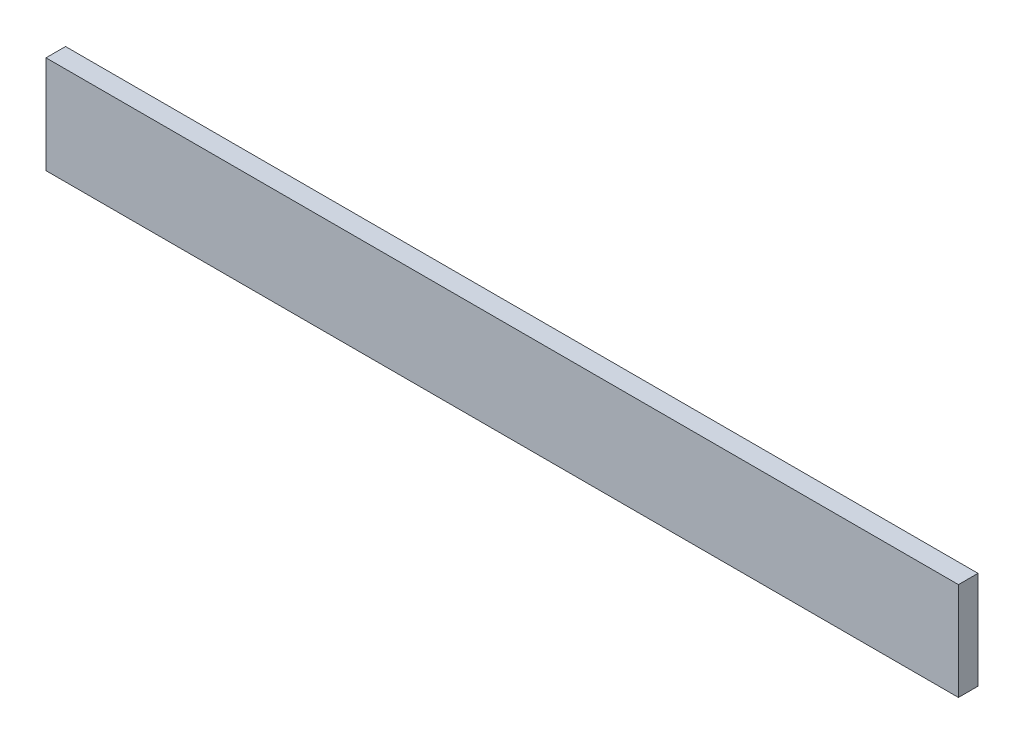
ISO-10303-21;
HEADER;
FILE_DESCRIPTION(('STEP AP214'),'2;1');
FILE_NAME('part.step','',(''),(''),'','','');
FILE_SCHEMA(('AUTOMOTIVE_DESIGN { 1 0 10303 214 1 1 1 1 }'));
ENDSEC;
DATA;
#1=APPLICATION_CONTEXT('core data for automotive mechanical design processes');
#2=APPLICATION_PROTOCOL_DEFINITION('international standard','automotive_design',2000,#1);
#3=PRODUCT_CONTEXT('',#1,'mechanical');
#4=PRODUCT('Part','Part','',(#3));
#5=PRODUCT_RELATED_PRODUCT_CATEGORY('part','',(#4));
#6=PRODUCT_DEFINITION_FORMATION('','',#4);
#7=PRODUCT_DEFINITION_CONTEXT('part definition',#1,'design');
#8=PRODUCT_DEFINITION('design','',#6,#7);
#9=PRODUCT_DEFINITION_SHAPE('','',#8);
#10=(LENGTH_UNIT() NAMED_UNIT(*) SI_UNIT(.MILLI.,.METRE.));
#11=(NAMED_UNIT(*) PLANE_ANGLE_UNIT() SI_UNIT($,.RADIAN.));
#12=(NAMED_UNIT(*) SI_UNIT($,.STERADIAN.) SOLID_ANGLE_UNIT());
#13=UNCERTAINTY_MEASURE_WITH_UNIT(LENGTH_MEASURE(1.E-05),#10,'distance_accuracy_value','');
#14=(GEOMETRIC_REPRESENTATION_CONTEXT(3) GLOBAL_UNCERTAINTY_ASSIGNED_CONTEXT((#13)) GLOBAL_UNIT_ASSIGNED_CONTEXT((#10,
#11,#12)) REPRESENTATION_CONTEXT('',''));
#15=CARTESIAN_POINT('',(0.,0.,0.));
#16=DIRECTION('',(0.,0.,1.));
#17=DIRECTION('',(1.,0.,0.));
#18=AXIS2_PLACEMENT_3D('',#15,#16,#17);
#19=CARTESIAN_POINT('',(-70.,-7.5,3.));
#20=DIRECTION('',(1.,0.,0.));
#21=DIRECTION('',(0.,0.,-1.));
#22=AXIS2_PLACEMENT_3D('',#19,#20,#21);
#23=PLANE('',#22);
#24=DIRECTION('',(0.,-1.,0.));
#25=VECTOR('',#24,1.);
#26=CARTESIAN_POINT('',(-70.,-7.5,0.));
#27=LINE('',#26,#25);
#28=CARTESIAN_POINT('',(-70.,7.5,0.));
#29=VERTEX_POINT('',#28);
#30=CARTESIAN_POINT('',(-70.,-7.5,0.));
#31=VERTEX_POINT('',#30);
#32=EDGE_CURVE('E105',#29,#31,#27,.T.);
#33=ORIENTED_EDGE('',*,*,#32,.T.);
#34=DIRECTION('',(0.,0.,-1.));
#35=VECTOR('',#34,1.);
#36=CARTESIAN_POINT('',(-70.,-7.5,3.));
#37=LINE('',#36,#35);
#38=CARTESIAN_POINT('',(-70.,-7.5,3.));
#39=VERTEX_POINT('',#38);
#40=EDGE_CURVE('E11',#39,#31,#37,.T.);
#41=ORIENTED_EDGE('',*,*,#40,.F.);
#42=DIRECTION('',(0.,-1.,0.));
#43=VECTOR('',#42,1.);
#44=CARTESIAN_POINT('',(-70.,-7.5,3.));
#45=LINE('',#44,#43);
#46=CARTESIAN_POINT('',(-70.,7.5,3.));
#47=VERTEX_POINT('',#46);
#48=EDGE_CURVE('E89',#47,#39,#45,.T.);
#49=ORIENTED_EDGE('',*,*,#48,.F.);
#50=DIRECTION('',(0.,0.,-1.));
#51=VECTOR('',#50,1.);
#52=CARTESIAN_POINT('',(-70.,7.5,3.));
#53=LINE('',#52,#51);
#54=EDGE_CURVE('E98',#47,#29,#53,.T.);
#55=ORIENTED_EDGE('',*,*,#54,.T.);
#56=EDGE_LOOP('',(#33,#41,#49,#55));
#57=FACE_BOUND('',#56,.T.);
#58=ADVANCED_FACE('F39',(#57),#23,.F.);
#59=CARTESIAN_POINT('',(-70.,-7.5,3.));
#60=DIRECTION('',(0.,1.,0.));
#61=DIRECTION('',(0.,0.,1.));
#62=AXIS2_PLACEMENT_3D('',#59,#60,#61);
#63=PLANE('',#62);
#64=DIRECTION('',(1.,0.,0.));
#65=VECTOR('',#64,1.);
#66=CARTESIAN_POINT('',(-70.,-7.5,0.));
#67=LINE('',#66,#65);
#68=CARTESIAN_POINT('',(70.,-7.5,0.));
#69=VERTEX_POINT('',#68);
#70=EDGE_CURVE('E94',#31,#69,#67,.T.);
#71=ORIENTED_EDGE('',*,*,#70,.T.);
#72=DIRECTION('',(0.,0.,-1.));
#73=VECTOR('',#72,1.);
#74=CARTESIAN_POINT('',(70.,-7.5,3.));
#75=LINE('',#74,#73);
#76=CARTESIAN_POINT('',(70.,-7.5,3.));
#77=VERTEX_POINT('',#76);
#78=EDGE_CURVE('E50',#77,#69,#75,.T.);
#79=ORIENTED_EDGE('',*,*,#78,.F.);
#80=DIRECTION('',(1.,0.,0.));
#81=VECTOR('',#80,1.);
#82=CARTESIAN_POINT('',(-70.,-7.5,3.));
#83=LINE('',#82,#81);
#84=EDGE_CURVE('E82',#39,#77,#83,.T.);
#85=ORIENTED_EDGE('',*,*,#84,.F.);
#86=ORIENTED_EDGE('',*,*,#40,.T.);
#87=EDGE_LOOP('',(#71,#79,#85,#86));
#88=FACE_BOUND('',#87,.T.);
#89=ADVANCED_FACE('F91',(#88),#63,.F.);
#90=CARTESIAN_POINT('',(70.,-7.5,3.));
#91=DIRECTION('',(-1.,0.,0.));
#92=DIRECTION('',(0.,0.,1.));
#93=AXIS2_PLACEMENT_3D('',#90,#91,#92);
#94=PLANE('',#93);
#95=DIRECTION('',(0.,1.,0.));
#96=VECTOR('',#95,1.);
#97=CARTESIAN_POINT('',(70.,-7.5,0.));
#98=LINE('',#97,#96);
#99=CARTESIAN_POINT('',(70.,7.5,0.));
#100=VERTEX_POINT('',#99);
#101=EDGE_CURVE('E75',#69,#100,#98,.T.);
#102=ORIENTED_EDGE('',*,*,#101,.T.);
#103=DIRECTION('',(0.,0.,-1.));
#104=VECTOR('',#103,1.);
#105=CARTESIAN_POINT('',(70.,7.5,3.));
#106=LINE('',#105,#104);
#107=CARTESIAN_POINT('',(70.,7.5,3.));
#108=VERTEX_POINT('',#107);
#109=EDGE_CURVE('E92',#108,#100,#106,.T.);
#110=ORIENTED_EDGE('',*,*,#109,.F.);
#111=DIRECTION('',(0.,1.,0.));
#112=VECTOR('',#111,1.);
#113=CARTESIAN_POINT('',(70.,-7.5,3.));
#114=LINE('',#113,#112);
#115=EDGE_CURVE('E86',#77,#108,#114,.T.);
#116=ORIENTED_EDGE('',*,*,#115,.F.);
#117=ORIENTED_EDGE('',*,*,#78,.T.);
#118=EDGE_LOOP('',(#102,#110,#116,#117));
#119=FACE_BOUND('',#118,.T.);
#120=ADVANCED_FACE('F96',(#119),#94,.F.);
#121=CARTESIAN_POINT('',(-70.,7.5,3.));
#122=DIRECTION('',(0.,-1.,0.));
#123=DIRECTION('',(0.,0.,-1.));
#124=AXIS2_PLACEMENT_3D('',#121,#122,#123);
#125=PLANE('',#124);
#126=DIRECTION('',(-1.,0.,0.));
#127=VECTOR('',#126,1.);
#128=CARTESIAN_POINT('',(-70.,7.5,0.));
#129=LINE('',#128,#127);
#130=EDGE_CURVE('E79',#100,#29,#129,.T.);
#131=ORIENTED_EDGE('',*,*,#130,.T.);
#132=ORIENTED_EDGE('',*,*,#54,.F.);
#133=DIRECTION('',(-1.,0.,0.));
#134=VECTOR('',#133,1.);
#135=CARTESIAN_POINT('',(-70.,7.5,3.));
#136=LINE('',#135,#134);
#137=EDGE_CURVE('E54',#108,#47,#136,.T.);
#138=ORIENTED_EDGE('',*,*,#137,.F.);
#139=ORIENTED_EDGE('',*,*,#109,.T.);
#140=EDGE_LOOP('',(#131,#132,#138,#139));
#141=FACE_BOUND('',#140,.T.);
#142=ADVANCED_FACE('F108',(#141),#125,.F.);
#143=CARTESIAN_POINT('',(0.,0.,3.));
#144=DIRECTION('',(0.,0.,-1.));
#145=DIRECTION('',(-1.,0.,0.));
#146=AXIS2_PLACEMENT_3D('',#143,#144,#145);
#147=PLANE('',#146);
#148=ORIENTED_EDGE('',*,*,#48,.T.);
#149=ORIENTED_EDGE('',*,*,#84,.T.);
#150=ORIENTED_EDGE('',*,*,#115,.T.);
#151=ORIENTED_EDGE('',*,*,#137,.T.);
#152=EDGE_LOOP('',(#148,#149,#150,#151));
#153=FACE_BOUND('',#152,.T.);
#154=ADVANCED_FACE('F88',(#153),#147,.F.);
#155=CARTESIAN_POINT('',(0.,0.,0.));
#156=DIRECTION('',(0.,0.,-1.));
#157=DIRECTION('',(-1.,0.,0.));
#158=AXIS2_PLACEMENT_3D('',#155,#156,#157);
#159=PLANE('',#158);
#160=ORIENTED_EDGE('',*,*,#32,.F.);
#161=ORIENTED_EDGE('',*,*,#130,.F.);
#162=ORIENTED_EDGE('',*,*,#101,.F.);
#163=ORIENTED_EDGE('',*,*,#70,.F.);
#164=EDGE_LOOP('',(#160,#161,#162,#163));
#165=FACE_BOUND('',#164,.T.);
#166=ADVANCED_FACE('F115',(#165),#159,.T.);
#167=CLOSED_SHELL('',(#58,#89,#120,#142,#154,#166));
#168=MANIFOLD_SOLID_BREP('B2',#167);
#169=ADVANCED_BREP_SHAPE_REPRESENTATION('',(#18,#168),#14);
#170=SHAPE_DEFINITION_REPRESENTATION(#9,#169);
ENDSEC;
END-ISO-10303-21;
